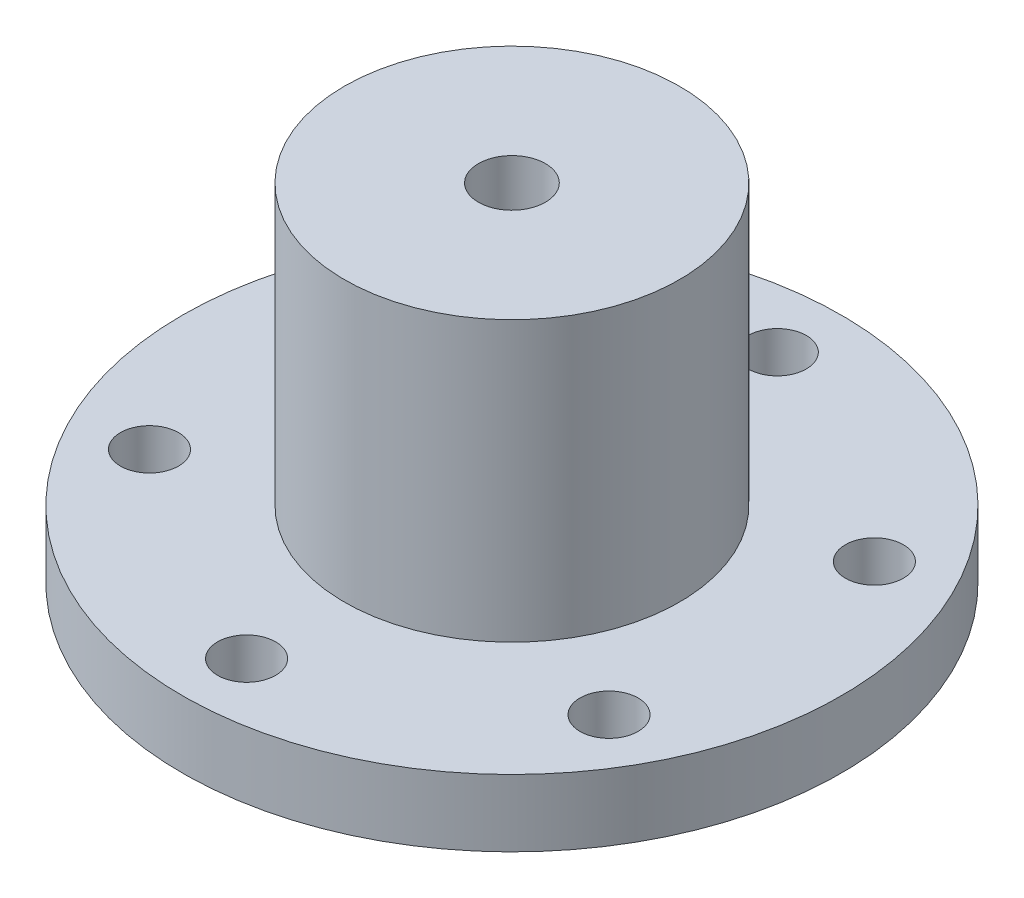
ISO-10303-21;
HEADER;
FILE_DESCRIPTION(('STEP AP214'),'2;1');
FILE_NAME('part.step','',(''),(''),'','','');
FILE_SCHEMA(('AUTOMOTIVE_DESIGN { 1 0 10303 214 1 1 1 1 }'));
ENDSEC;
DATA;
#1=APPLICATION_CONTEXT('core data for automotive mechanical design processes');
#2=APPLICATION_PROTOCOL_DEFINITION('international standard','automotive_design',2000,#1);
#3=PRODUCT_CONTEXT('',#1,'mechanical');
#4=PRODUCT('Part','Part','',(#3));
#5=PRODUCT_RELATED_PRODUCT_CATEGORY('part','',(#4));
#6=PRODUCT_DEFINITION_FORMATION('','',#4);
#7=PRODUCT_DEFINITION_CONTEXT('part definition',#1,'design');
#8=PRODUCT_DEFINITION('design','',#6,#7);
#9=PRODUCT_DEFINITION_SHAPE('','',#8);
#10=(LENGTH_UNIT() NAMED_UNIT(*) SI_UNIT(.MILLI.,.METRE.));
#11=(NAMED_UNIT(*) PLANE_ANGLE_UNIT() SI_UNIT($,.RADIAN.));
#12=(NAMED_UNIT(*) SI_UNIT($,.STERADIAN.) SOLID_ANGLE_UNIT());
#13=UNCERTAINTY_MEASURE_WITH_UNIT(LENGTH_MEASURE(1.E-05),#10,'distance_accuracy_value','');
#14=(GEOMETRIC_REPRESENTATION_CONTEXT(3) GLOBAL_UNCERTAINTY_ASSIGNED_CONTEXT((#13)) GLOBAL_UNIT_ASSIGNED_CONTEXT((#10,
#11,#12)) REPRESENTATION_CONTEXT('',''));
#15=CARTESIAN_POINT('',(0.,0.,0.));
#16=DIRECTION('',(0.,0.,1.));
#17=DIRECTION('',(1.,0.,0.));
#18=AXIS2_PLACEMENT_3D('',#15,#16,#17);
#19=CARTESIAN_POINT('',(0.,-15.5,0.));
#20=DIRECTION('',(0.,1.,0.));
#21=DIRECTION('',(-1.,0.,0.));
#22=AXIS2_PLACEMENT_3D('',#19,#20,#21);
#23=PLANE('',#22);
#24=CARTESIAN_POINT('',(-20.5681033398804,-15.5,-11.875));
#25=DIRECTION('',(0.,1.,0.));
#26=DIRECTION('',(-1.,0.,0.));
#27=AXIS2_PLACEMENT_3D('',#24,#25,#26);
#28=CIRCLE('',#27,2.60000000000028);
#29=CARTESIAN_POINT('',(-23.1681033398807,-15.5,-11.875));
#30=VERTEX_POINT('',#29);
#31=EDGE_CURVE('E57',#30,#30,#28,.F.);
#32=ORIENTED_EDGE('',*,*,#31,.F.);
#33=EDGE_LOOP('',(#32));
#34=FACE_BOUND('',#33,.T.);
#35=CARTESIAN_POINT('',(-20.5681033398804,-15.5,11.875));
#36=DIRECTION('',(0.,1.,0.));
#37=DIRECTION('',(-1.,0.,0.));
#38=AXIS2_PLACEMENT_3D('',#35,#36,#37);
#39=CIRCLE('',#38,2.60000000000021);
#40=CARTESIAN_POINT('',(-23.1681033398806,-15.5,11.875));
#41=VERTEX_POINT('',#40);
#42=EDGE_CURVE('E64',#41,#41,#39,.F.);
#43=ORIENTED_EDGE('',*,*,#42,.F.);
#44=EDGE_LOOP('',(#43));
#45=FACE_BOUND('',#44,.T.);
#46=CARTESIAN_POINT('',(0.,-15.5,23.75));
#47=DIRECTION('',(0.,1.,0.));
#48=DIRECTION('',(-1.,0.,0.));
#49=AXIS2_PLACEMENT_3D('',#46,#47,#48);
#50=CIRCLE('',#49,2.60000000000015);
#51=CARTESIAN_POINT('',(-2.60000000000016,-15.5,23.75));
#52=VERTEX_POINT('',#51);
#53=EDGE_CURVE('E70',#52,#52,#50,.F.);
#54=ORIENTED_EDGE('',*,*,#53,.F.);
#55=EDGE_LOOP('',(#54));
#56=FACE_BOUND('',#55,.T.);
#57=CARTESIAN_POINT('',(20.5681033398804,-15.5,11.875));
#58=DIRECTION('',(0.,1.,0.));
#59=DIRECTION('',(-1.,0.,0.));
#60=AXIS2_PLACEMENT_3D('',#57,#58,#59);
#61=CIRCLE('',#60,2.6000000000001);
#62=CARTESIAN_POINT('',(17.9681033398803,-15.5,11.875));
#63=VERTEX_POINT('',#62);
#64=EDGE_CURVE('E76',#63,#63,#61,.F.);
#65=ORIENTED_EDGE('',*,*,#64,.F.);
#66=EDGE_LOOP('',(#65));
#67=FACE_BOUND('',#66,.T.);
#68=CARTESIAN_POINT('',(20.5681033398804,-15.5,-11.875));
#69=DIRECTION('',(0.,1.,0.));
#70=DIRECTION('',(-1.,0.,0.));
#71=AXIS2_PLACEMENT_3D('',#68,#69,#70);
#72=CIRCLE('',#71,2.60000000000006);
#73=CARTESIAN_POINT('',(17.9681033398804,-15.5,-11.875));
#74=VERTEX_POINT('',#73);
#75=EDGE_CURVE('E82',#74,#74,#72,.F.);
#76=ORIENTED_EDGE('',*,*,#75,.F.);
#77=EDGE_LOOP('',(#76));
#78=FACE_BOUND('',#77,.T.);
#79=CARTESIAN_POINT('',(0.,-15.5,-23.75));
#80=DIRECTION('',(0.,1.,0.));
#81=DIRECTION('',(-1.,0.,0.));
#82=AXIS2_PLACEMENT_3D('',#79,#80,#81);
#83=CIRCLE('',#82,2.6);
#84=CARTESIAN_POINT('',(-2.6,-15.5,-23.75));
#85=VERTEX_POINT('',#84);
#86=EDGE_CURVE('E56',#85,#85,#83,.F.);
#87=ORIENTED_EDGE('',*,*,#86,.F.);
#88=EDGE_LOOP('',(#87));
#89=FACE_BOUND('',#88,.T.);
#90=CARTESIAN_POINT('',(0.,-15.5,0.));
#91=DIRECTION('',(0.,1.,0.));
#92=DIRECTION('',(-1.,0.,0.));
#93=AXIS2_PLACEMENT_3D('',#90,#91,#92);
#94=CIRCLE('',#93,3.);
#95=CARTESIAN_POINT('',(-3.,-15.5,0.));
#96=VERTEX_POINT('',#95);
#97=EDGE_CURVE('E50',#96,#96,#94,.F.);
#98=ORIENTED_EDGE('',*,*,#97,.F.);
#99=EDGE_LOOP('',(#98));
#100=FACE_BOUND('',#99,.T.);
#101=CARTESIAN_POINT('',(0.,-15.5,0.));
#102=DIRECTION('',(0.,1.,0.));
#103=DIRECTION('',(-1.,0.,0.));
#104=AXIS2_PLACEMENT_3D('',#101,#102,#103);
#105=CIRCLE('',#104,29.5);
#106=CARTESIAN_POINT('',(-29.5,-15.5,0.));
#107=VERTEX_POINT('',#106);
#108=EDGE_CURVE('E10',#107,#107,#105,.T.);
#109=ORIENTED_EDGE('',*,*,#108,.F.);
#110=EDGE_LOOP('',(#109));
#111=FACE_BOUND('',#110,.T.);
#112=ADVANCED_FACE('F31',(#34,#45,#56,#67,#78,#89,#100,#111),#23,.F.);
#113=CARTESIAN_POINT('',(0.,0.,0.));
#114=DIRECTION('',(0.,1.,0.));
#115=DIRECTION('',(-1.,0.,0.));
#116=AXIS2_PLACEMENT_3D('',#113,#114,#115);
#117=CYLINDRICAL_SURFACE('',#116,29.5);
#118=CARTESIAN_POINT('',(0.,-9.5,0.));
#119=DIRECTION('',(0.,1.,0.));
#120=DIRECTION('',(-1.,0.,0.));
#121=AXIS2_PLACEMENT_3D('',#118,#119,#120);
#122=CIRCLE('',#121,29.5);
#123=CARTESIAN_POINT('',(-29.5,-9.50000000000001,0.));
#124=VERTEX_POINT('',#123);
#125=EDGE_CURVE('E37',#124,#124,#122,.T.);
#126=ORIENTED_EDGE('',*,*,#125,.F.);
#127=EDGE_LOOP('',(#126));
#128=FACE_BOUND('',#127,.T.);
#129=ORIENTED_EDGE('',*,*,#108,.T.);
#130=EDGE_LOOP('',(#129));
#131=FACE_BOUND('',#130,.T.);
#132=ADVANCED_FACE('F100',(#128,#131),#117,.T.);
#133=CARTESIAN_POINT('',(29.5,-9.5,0.));
#134=DIRECTION('',(0.,-1.,0.));
#135=DIRECTION('',(1.,0.,0.));
#136=AXIS2_PLACEMENT_3D('',#133,#134,#135);
#137=PLANE('',#136);
#138=CARTESIAN_POINT('',(-20.5681033398804,-9.50000000000001,-11.875));
#139=DIRECTION('',(0.,-1.,0.));
#140=DIRECTION('',(1.,0.,0.));
#141=AXIS2_PLACEMENT_3D('',#138,#139,#140);
#142=CIRCLE('',#141,2.60000000000028);
#143=CARTESIAN_POINT('',(-17.9681033398802,-9.50000000000001,-11.875));
#144=VERTEX_POINT('',#143);
#145=EDGE_CURVE('E61',#144,#144,#142,.F.);
#146=ORIENTED_EDGE('',*,*,#145,.F.);
#147=EDGE_LOOP('',(#146));
#148=FACE_BOUND('',#147,.T.);
#149=CARTESIAN_POINT('',(-20.5681033398804,-9.50000000000001,11.875));
#150=DIRECTION('',(0.,-1.,0.));
#151=DIRECTION('',(1.,0.,0.));
#152=AXIS2_PLACEMENT_3D('',#149,#150,#151);
#153=CIRCLE('',#152,2.60000000000021);
#154=CARTESIAN_POINT('',(-17.9681033398802,-9.50000000000001,11.875));
#155=VERTEX_POINT('',#154);
#156=EDGE_CURVE('E60',#155,#155,#153,.F.);
#157=ORIENTED_EDGE('',*,*,#156,.F.);
#158=EDGE_LOOP('',(#157));
#159=FACE_BOUND('',#158,.T.);
#160=CARTESIAN_POINT('',(0.,-9.50000000000001,23.75));
#161=DIRECTION('',(0.,-1.,0.));
#162=DIRECTION('',(1.,0.,0.));
#163=AXIS2_PLACEMENT_3D('',#160,#161,#162);
#164=CIRCLE('',#163,2.60000000000015);
#165=CARTESIAN_POINT('',(2.60000000000014,-9.50000000000001,23.75));
#166=VERTEX_POINT('',#165);
#167=EDGE_CURVE('E67',#166,#166,#164,.F.);
#168=ORIENTED_EDGE('',*,*,#167,.F.);
#169=EDGE_LOOP('',(#168));
#170=FACE_BOUND('',#169,.T.);
#171=CARTESIAN_POINT('',(20.5681033398804,-9.5,11.875));
#172=DIRECTION('',(0.,-1.,0.));
#173=DIRECTION('',(1.,0.,0.));
#174=AXIS2_PLACEMENT_3D('',#171,#172,#173);
#175=CIRCLE('',#174,2.6000000000001);
#176=CARTESIAN_POINT('',(23.1681033398805,-9.5,11.875));
#177=VERTEX_POINT('',#176);
#178=EDGE_CURVE('E73',#177,#177,#175,.F.);
#179=ORIENTED_EDGE('',*,*,#178,.F.);
#180=EDGE_LOOP('',(#179));
#181=FACE_BOUND('',#180,.T.);
#182=CARTESIAN_POINT('',(20.5681033398804,-9.5,-11.875));
#183=DIRECTION('',(0.,-1.,0.));
#184=DIRECTION('',(1.,0.,0.));
#185=AXIS2_PLACEMENT_3D('',#182,#183,#184);
#186=CIRCLE('',#185,2.60000000000006);
#187=CARTESIAN_POINT('',(23.1681033398805,-9.5,-11.875));
#188=VERTEX_POINT('',#187);
#189=EDGE_CURVE('E79',#188,#188,#186,.F.);
#190=ORIENTED_EDGE('',*,*,#189,.F.);
#191=EDGE_LOOP('',(#190));
#192=FACE_BOUND('',#191,.T.);
#193=CARTESIAN_POINT('',(0.,-9.50000000000001,-23.75));
#194=DIRECTION('',(0.,-1.,0.));
#195=DIRECTION('',(1.,0.,0.));
#196=AXIS2_PLACEMENT_3D('',#193,#194,#195);
#197=CIRCLE('',#196,2.6);
#198=CARTESIAN_POINT('',(2.6,-9.50000000000001,-23.75));
#199=VERTEX_POINT('',#198);
#200=EDGE_CURVE('E85',#199,#199,#197,.F.);
#201=ORIENTED_EDGE('',*,*,#200,.F.);
#202=EDGE_LOOP('',(#201));
#203=FACE_BOUND('',#202,.T.);
#204=CARTESIAN_POINT('',(0.,-9.50000000000001,0.));
#205=DIRECTION('',(0.,1.,0.));
#206=DIRECTION('',(-1.,0.,0.));
#207=AXIS2_PLACEMENT_3D('',#204,#205,#206);
#208=CIRCLE('',#207,15.);
#209=CARTESIAN_POINT('',(-15.,-9.50000000000001,0.));
#210=VERTEX_POINT('',#209);
#211=EDGE_CURVE('E41',#210,#210,#208,.T.);
#212=ORIENTED_EDGE('',*,*,#211,.F.);
#213=EDGE_LOOP('',(#212));
#214=FACE_BOUND('',#213,.T.);
#215=ORIENTED_EDGE('',*,*,#125,.T.);
#216=EDGE_LOOP('',(#215));
#217=FACE_BOUND('',#216,.T.);
#218=ADVANCED_FACE('F96',(#148,#159,#170,#181,#192,#203,#214,#217),#137,.F.);
#219=CARTESIAN_POINT('',(0.,0.,0.));
#220=DIRECTION('',(0.,1.,0.));
#221=DIRECTION('',(-1.,0.,0.));
#222=AXIS2_PLACEMENT_3D('',#219,#220,#221);
#223=CYLINDRICAL_SURFACE('',#222,15.);
#224=CARTESIAN_POINT('',(0.,15.5,0.));
#225=DIRECTION('',(0.,1.,0.));
#226=DIRECTION('',(-1.,0.,0.));
#227=AXIS2_PLACEMENT_3D('',#224,#225,#226);
#228=CIRCLE('',#227,15.);
#229=CARTESIAN_POINT('',(-15.,15.5,0.));
#230=VERTEX_POINT('',#229);
#231=EDGE_CURVE('E45',#230,#230,#228,.T.);
#232=ORIENTED_EDGE('',*,*,#231,.F.);
#233=EDGE_LOOP('',(#232));
#234=FACE_BOUND('',#233,.T.);
#235=ORIENTED_EDGE('',*,*,#211,.T.);
#236=EDGE_LOOP('',(#235));
#237=FACE_BOUND('',#236,.T.);
#238=ADVANCED_FACE('F99',(#234,#237),#223,.T.);
#239=CARTESIAN_POINT('',(15.,15.5,0.));
#240=DIRECTION('',(0.,-1.,0.));
#241=DIRECTION('',(1.,0.,0.));
#242=AXIS2_PLACEMENT_3D('',#239,#240,#241);
#243=PLANE('',#242);
#244=CARTESIAN_POINT('',(0.,15.5,0.));
#245=DIRECTION('',(0.,1.,0.));
#246=DIRECTION('',(-1.,0.,0.));
#247=AXIS2_PLACEMENT_3D('',#244,#245,#246);
#248=CIRCLE('',#247,3.);
#249=CARTESIAN_POINT('',(-3.,15.5,0.));
#250=VERTEX_POINT('',#249);
#251=EDGE_CURVE('E53',#250,#250,#248,.T.);
#252=ORIENTED_EDGE('',*,*,#251,.F.);
#253=EDGE_LOOP('',(#252));
#254=FACE_BOUND('',#253,.T.);
#255=ORIENTED_EDGE('',*,*,#231,.T.);
#256=EDGE_LOOP('',(#255));
#257=FACE_BOUND('',#256,.T.);
#258=ADVANCED_FACE('F106',(#254,#257),#243,.F.);
#259=CARTESIAN_POINT('',(0.,-15.501,0.));
#260=DIRECTION('',(0.,1.,0.));
#261=DIRECTION('',(-1.,0.,0.));
#262=AXIS2_PLACEMENT_3D('',#259,#260,#261);
#263=CYLINDRICAL_SURFACE('',#262,3.);
#264=ORIENTED_EDGE('',*,*,#251,.T.);
#265=EDGE_LOOP('',(#264));
#266=FACE_BOUND('',#265,.T.);
#267=ORIENTED_EDGE('',*,*,#97,.T.);
#268=EDGE_LOOP('',(#267));
#269=FACE_BOUND('',#268,.T.);
#270=ADVANCED_FACE('F112',(#266,#269),#263,.F.);
#271=CARTESIAN_POINT('',(0.,-15.501,-23.75));
#272=DIRECTION('',(0.,1.,0.));
#273=DIRECTION('',(-1.,0.,0.));
#274=AXIS2_PLACEMENT_3D('',#271,#272,#273);
#275=CYLINDRICAL_SURFACE('',#274,2.6);
#276=ORIENTED_EDGE('',*,*,#200,.T.);
#277=EDGE_LOOP('',(#276));
#278=FACE_BOUND('',#277,.T.);
#279=ORIENTED_EDGE('',*,*,#86,.T.);
#280=EDGE_LOOP('',(#279));
#281=FACE_BOUND('',#280,.T.);
#282=ADVANCED_FACE('F93',(#278,#281),#275,.F.);
#283=CARTESIAN_POINT('',(20.5681033398804,-15.501,-11.875));
#284=DIRECTION('',(0.,1.,0.));
#285=DIRECTION('',(-1.,0.,0.));
#286=AXIS2_PLACEMENT_3D('',#283,#284,#285);
#287=CYLINDRICAL_SURFACE('',#286,2.60000000000006);
#288=ORIENTED_EDGE('',*,*,#189,.T.);
#289=EDGE_LOOP('',(#288));
#290=FACE_BOUND('',#289,.T.);
#291=ORIENTED_EDGE('',*,*,#75,.T.);
#292=EDGE_LOOP('',(#291));
#293=FACE_BOUND('',#292,.T.);
#294=ADVANCED_FACE('F143',(#290,#293),#287,.F.);
#295=CARTESIAN_POINT('',(20.5681033398804,-15.501,11.875));
#296=DIRECTION('',(0.,1.,0.));
#297=DIRECTION('',(-1.,0.,0.));
#298=AXIS2_PLACEMENT_3D('',#295,#296,#297);
#299=CYLINDRICAL_SURFACE('',#298,2.6000000000001);
#300=ORIENTED_EDGE('',*,*,#178,.T.);
#301=EDGE_LOOP('',(#300));
#302=FACE_BOUND('',#301,.T.);
#303=ORIENTED_EDGE('',*,*,#64,.T.);
#304=EDGE_LOOP('',(#303));
#305=FACE_BOUND('',#304,.T.);
#306=ADVANCED_FACE('F157',(#302,#305),#299,.F.);
#307=CARTESIAN_POINT('',(0.,-15.501,23.75));
#308=DIRECTION('',(0.,1.,0.));
#309=DIRECTION('',(-1.,0.,0.));
#310=AXIS2_PLACEMENT_3D('',#307,#308,#309);
#311=CYLINDRICAL_SURFACE('',#310,2.60000000000015);
#312=ORIENTED_EDGE('',*,*,#167,.T.);
#313=EDGE_LOOP('',(#312));
#314=FACE_BOUND('',#313,.T.);
#315=ORIENTED_EDGE('',*,*,#53,.T.);
#316=EDGE_LOOP('',(#315));
#317=FACE_BOUND('',#316,.T.);
#318=ADVANCED_FACE('F153',(#314,#317),#311,.F.);
#319=CARTESIAN_POINT('',(-20.5681033398804,-15.501,11.875));
#320=DIRECTION('',(0.,1.,0.));
#321=DIRECTION('',(-1.,0.,0.));
#322=AXIS2_PLACEMENT_3D('',#319,#320,#321);
#323=CYLINDRICAL_SURFACE('',#322,2.60000000000021);
#324=ORIENTED_EDGE('',*,*,#156,.T.);
#325=EDGE_LOOP('',(#324));
#326=FACE_BOUND('',#325,.T.);
#327=ORIENTED_EDGE('',*,*,#42,.T.);
#328=EDGE_LOOP('',(#327));
#329=FACE_BOUND('',#328,.T.);
#330=ADVANCED_FACE('F149',(#326,#329),#323,.F.);
#331=CARTESIAN_POINT('',(-20.5681033398804,-15.501,-11.875));
#332=DIRECTION('',(0.,1.,0.));
#333=DIRECTION('',(-1.,0.,0.));
#334=AXIS2_PLACEMENT_3D('',#331,#332,#333);
#335=CYLINDRICAL_SURFACE('',#334,2.60000000000028);
#336=ORIENTED_EDGE('',*,*,#145,.T.);
#337=EDGE_LOOP('',(#336));
#338=FACE_BOUND('',#337,.T.);
#339=ORIENTED_EDGE('',*,*,#31,.T.);
#340=EDGE_LOOP('',(#339));
#341=FACE_BOUND('',#340,.T.);
#342=ADVANCED_FACE('F146',(#338,#341),#335,.F.);
#343=CLOSED_SHELL('',(#112,#132,#218,#238,#258,#270,#282,#294,#306,#318,#330,#342));
#344=MANIFOLD_SOLID_BREP('B2',#343);
#345=ADVANCED_BREP_SHAPE_REPRESENTATION('',(#18,#344),#14);
#346=SHAPE_DEFINITION_REPRESENTATION(#9,#345);
ENDSEC;
END-ISO-10303-21;
